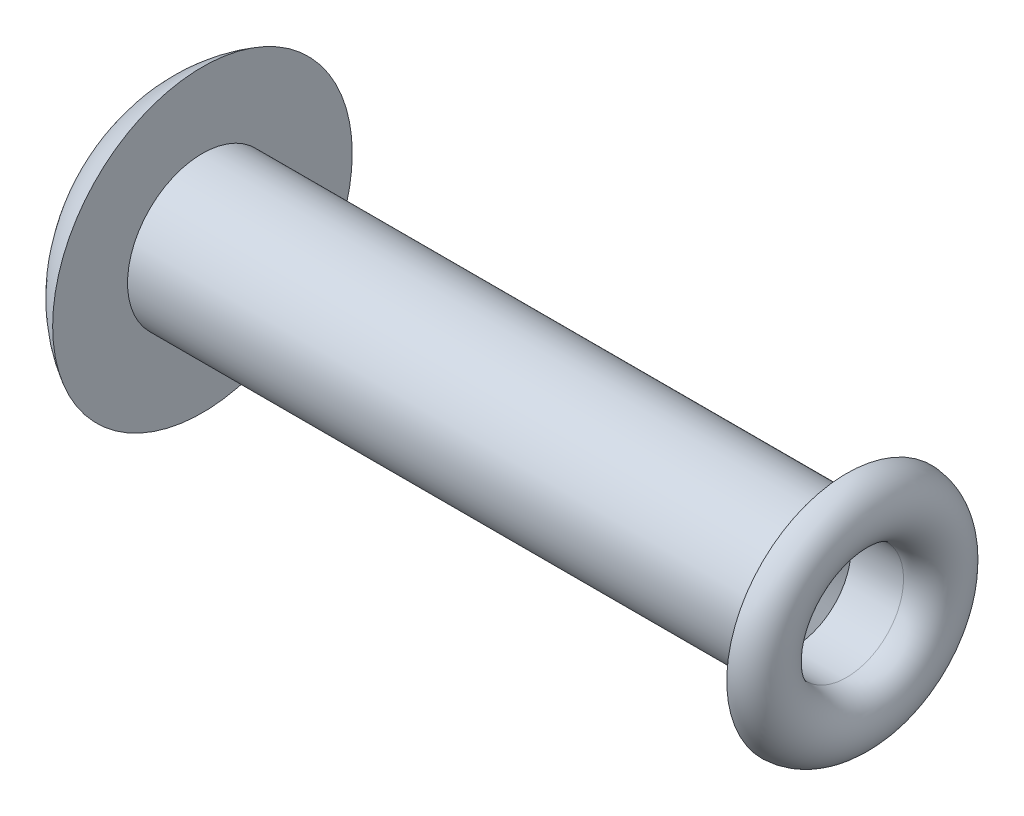
ISO-10303-21;
HEADER;
FILE_DESCRIPTION(('STEP AP214'),'2;1');
FILE_NAME('part.step','',(''),(''),'','','');
FILE_SCHEMA(('AUTOMOTIVE_DESIGN { 1 0 10303 214 1 1 1 1 }'));
ENDSEC;
DATA;
#1=APPLICATION_CONTEXT('core data for automotive mechanical design processes');
#2=APPLICATION_PROTOCOL_DEFINITION('international standard','automotive_design',2000,#1);
#3=PRODUCT_CONTEXT('',#1,'mechanical');
#4=PRODUCT('Part','Part','',(#3));
#5=PRODUCT_RELATED_PRODUCT_CATEGORY('part','',(#4));
#6=PRODUCT_DEFINITION_FORMATION('','',#4);
#7=PRODUCT_DEFINITION_CONTEXT('part definition',#1,'design');
#8=PRODUCT_DEFINITION('design','',#6,#7);
#9=PRODUCT_DEFINITION_SHAPE('','',#8);
#10=(LENGTH_UNIT() NAMED_UNIT(*) SI_UNIT(.MILLI.,.METRE.));
#11=(NAMED_UNIT(*) PLANE_ANGLE_UNIT() SI_UNIT($,.RADIAN.));
#12=(NAMED_UNIT(*) SI_UNIT($,.STERADIAN.) SOLID_ANGLE_UNIT());
#13=UNCERTAINTY_MEASURE_WITH_UNIT(LENGTH_MEASURE(1.E-05),#10,'distance_accuracy_value','');
#14=(GEOMETRIC_REPRESENTATION_CONTEXT(3) GLOBAL_UNCERTAINTY_ASSIGNED_CONTEXT((#13)) GLOBAL_UNIT_ASSIGNED_CONTEXT((#10,
#11,#12)) REPRESENTATION_CONTEXT('',''));
#15=CARTESIAN_POINT('',(0.,0.,0.));
#16=DIRECTION('',(0.,0.,1.));
#17=DIRECTION('',(1.,0.,0.));
#18=AXIS2_PLACEMENT_3D('',#15,#16,#17);
#19=CARTESIAN_POINT('',(-43.,4.99999999999999,0.));
#20=DIRECTION('',(1.,0.,0.));
#21=DIRECTION('',(0.,0.,-1.));
#22=AXIS2_PLACEMENT_3D('',#19,#20,#21);
#23=PLANE('',#22);
#24=CARTESIAN_POINT('',(-43.,0.,0.));
#25=DIRECTION('',(1.,0.,0.));
#26=DIRECTION('',(0.,0.,-1.));
#27=AXIS2_PLACEMENT_3D('',#24,#25,#26);
#28=CIRCLE('',#27,9.99999999999999);
#29=CARTESIAN_POINT('',(-43.,0.,-9.99999999999999));
#30=VERTEX_POINT('',#29);
#31=EDGE_CURVE('E11',#30,#30,#28,.T.);
#32=ORIENTED_EDGE('',*,*,#31,.T.);
#33=EDGE_LOOP('',(#32));
#34=FACE_BOUND('',#33,.T.);
#35=CARTESIAN_POINT('',(-43.,0.,0.));
#36=DIRECTION('',(1.,0.,0.));
#37=DIRECTION('',(0.,0.,-1.));
#38=AXIS2_PLACEMENT_3D('',#35,#36,#37);
#39=CIRCLE('',#38,4.99999999999999);
#40=CARTESIAN_POINT('',(-43.,0.,-4.99999999999999));
#41=VERTEX_POINT('',#40);
#42=EDGE_CURVE('E68',#41,#41,#39,.T.);
#43=ORIENTED_EDGE('',*,*,#42,.F.);
#44=EDGE_LOOP('',(#43));
#45=FACE_BOUND('',#44,.T.);
#46=ADVANCED_FACE('F32',(#34,#45),#23,.T.);
#47=CARTESIAN_POINT('',(-38.8079545454545,0.,0.));
#48=DIRECTION('',(1.,0.,0.));
#49=DIRECTION('',(0.,0.,-1.));
#50=AXIS2_PLACEMENT_3D('',#47,#48,#49);
#51=DEGENERATE_TOROIDAL_SURFACE('',#50,2.49999999999999,8.59204545454545,.T.);
#52=CARTESIAN_POINT('',(-47.4,0.,0.));
#53=DIRECTION('',(1.,0.,0.));
#54=DIRECTION('',(0.,0.,-1.));
#55=AXIS2_PLACEMENT_3D('',#52,#53,#54);
#56=CIRCLE('',#55,2.49999999999999);
#57=CARTESIAN_POINT('',(-47.4,0.,-2.49999999999999));
#58=VERTEX_POINT('',#57);
#59=EDGE_CURVE('E38',#58,#58,#56,.T.);
#60=ORIENTED_EDGE('',*,*,#59,.T.);
#61=EDGE_LOOP('',(#60));
#62=FACE_BOUND('',#61,.T.);
#63=ORIENTED_EDGE('',*,*,#31,.F.);
#64=EDGE_LOOP('',(#63));
#65=FACE_BOUND('',#64,.T.);
#66=ADVANCED_FACE('F54',(#62,#65),#51,.T.);
#67=CARTESIAN_POINT('',(-47.4,0.,0.));
#68=DIRECTION('',(-1.,0.,0.));
#69=DIRECTION('',(0.,0.,1.));
#70=AXIS2_PLACEMENT_3D('',#67,#68,#69);
#71=PLANE('',#70);
#72=ORIENTED_EDGE('',*,*,#59,.F.);
#73=EDGE_LOOP('',(#72));
#74=FACE_BOUND('',#73,.T.);
#75=ADVANCED_FACE('F44',(#74),#71,.T.);
#76=CARTESIAN_POINT('',(-5.78327035230471,0.,0.));
#77=DIRECTION('',(1.,0.,0.));
#78=DIRECTION('',(0.,0.,-1.));
#79=AXIS2_PLACEMENT_3D('',#76,#77,#78);
#80=CONICAL_SURFACE('',#79,0.,1.02974425867666);
#81=CARTESIAN_POINT('',(-3.5,0.,0.));
#82=DIRECTION('',(1.,0.,0.));
#83=DIRECTION('',(0.,0.,-1.));
#84=AXIS2_PLACEMENT_3D('',#81,#82,#83);
#85=CIRCLE('',#84,3.79999999999999);
#86=CARTESIAN_POINT('',(-3.5,0.,-3.79999999999999));
#87=VERTEX_POINT('',#86);
#88=EDGE_CURVE('E84',#87,#87,#85,.T.);
#89=ORIENTED_EDGE('',*,*,#88,.T.);
#90=EDGE_LOOP('',(#89));
#91=FACE_BOUND('',#90,.T.);
#92=CARTESIAN_POINT('',(-5.78327035230471,0.,0.));
#93=VERTEX_POINT('',#92);
#94=VERTEX_LOOP('',#93);
#95=FACE_BOUND('',#94,.T.);
#96=ADVANCED_FACE('F41',(#91,#95),#80,.F.);
#97=CARTESIAN_POINT('',(40.3769281037232,0.,0.));
#98=DIRECTION('',(1.,0.,0.));
#99=DIRECTION('',(0.,0.,-1.));
#100=AXIS2_PLACEMENT_3D('',#97,#98,#99);
#101=CYLINDRICAL_SURFACE('',#100,3.8);
#102=CARTESIAN_POINT('',(0.,0.,0.));
#103=DIRECTION('',(1.,0.,0.));
#104=DIRECTION('',(0.,0.,-1.));
#105=AXIS2_PLACEMENT_3D('',#102,#103,#104);
#106=CIRCLE('',#105,3.8);
#107=CARTESIAN_POINT('',(0.,0.,-3.8));
#108=VERTEX_POINT('',#107);
#109=EDGE_CURVE('E81',#108,#108,#106,.T.);
#110=ORIENTED_EDGE('',*,*,#109,.T.);
#111=EDGE_LOOP('',(#110));
#112=FACE_BOUND('',#111,.T.);
#113=ORIENTED_EDGE('',*,*,#88,.F.);
#114=EDGE_LOOP('',(#113));
#115=FACE_BOUND('',#114,.T.);
#116=ADVANCED_FACE('F43',(#112,#115),#101,.F.);
#117=CARTESIAN_POINT('',(-0.102499999999998,0.,0.));
#118=DIRECTION('',(1.,0.,0.));
#119=DIRECTION('',(0.,0.,-1.));
#120=AXIS2_PLACEMENT_3D('',#117,#118,#119);
#121=TOROIDAL_SURFACE('',#120,5.9,2.1025);
#122=CARTESIAN_POINT('',(0.,0.,0.));
#123=DIRECTION('',(1.,0.,0.));
#124=DIRECTION('',(0.,0.,-1.));
#125=AXIS2_PLACEMENT_3D('',#122,#123,#124);
#126=CIRCLE('',#125,8.);
#127=CARTESIAN_POINT('',(0.,0.,-8.));
#128=VERTEX_POINT('',#127);
#129=EDGE_CURVE('E78',#128,#128,#126,.T.);
#130=ORIENTED_EDGE('',*,*,#129,.T.);
#131=EDGE_LOOP('',(#130));
#132=FACE_BOUND('',#131,.T.);
#133=ORIENTED_EDGE('',*,*,#109,.F.);
#134=EDGE_LOOP('',(#133));
#135=FACE_BOUND('',#134,.T.);
#136=ADVANCED_FACE('F51',(#132,#135),#121,.T.);
#137=CARTESIAN_POINT('',(0.,8.,0.));
#138=DIRECTION('',(-1.,0.,0.));
#139=DIRECTION('',(0.,0.,1.));
#140=AXIS2_PLACEMENT_3D('',#137,#138,#139);
#141=PLANE('',#140);
#142=CARTESIAN_POINT('',(0.,0.,0.));
#143=DIRECTION('',(1.,0.,0.));
#144=DIRECTION('',(0.,0.,-1.));
#145=AXIS2_PLACEMENT_3D('',#142,#143,#144);
#146=CIRCLE('',#145,6.79414414386049);
#147=CARTESIAN_POINT('',(0.,0.,-6.79414414386049));
#148=VERTEX_POINT('',#147);
#149=EDGE_CURVE('E73',#148,#148,#146,.T.);
#150=ORIENTED_EDGE('',*,*,#149,.T.);
#151=EDGE_LOOP('',(#150));
#152=FACE_BOUND('',#151,.T.);
#153=ORIENTED_EDGE('',*,*,#129,.F.);
#154=EDGE_LOOP('',(#153));
#155=FACE_BOUND('',#154,.T.);
#156=ADVANCED_FACE('F93',(#152,#155),#141,.T.);
#157=CARTESIAN_POINT('',(-0.102499999999998,0.,0.));
#158=DIRECTION('',(1.,0.,0.));
#159=DIRECTION('',(0.,0.,-1.));
#160=AXIS2_PLACEMENT_3D('',#157,#158,#159);
#161=TOROIDAL_SURFACE('',#160,5.9,0.900000000000006);
#162=CARTESIAN_POINT('',(-0.102499999999998,0.,0.));
#163=DIRECTION('',(1.,0.,0.));
#164=DIRECTION('',(0.,0.,-1.));
#165=AXIS2_PLACEMENT_3D('',#162,#163,#164);
#166=CIRCLE('',#165,4.99999999999999);
#167=CARTESIAN_POINT('',(-0.102499999999998,0.,-4.99999999999999));
#168=VERTEX_POINT('',#167);
#169=EDGE_CURVE('E70',#168,#168,#166,.T.);
#170=ORIENTED_EDGE('',*,*,#169,.T.);
#171=EDGE_LOOP('',(#170));
#172=FACE_BOUND('',#171,.T.);
#173=ORIENTED_EDGE('',*,*,#149,.F.);
#174=EDGE_LOOP('',(#173));
#175=FACE_BOUND('',#174,.T.);
#176=ADVANCED_FACE('F99',(#172,#175),#161,.F.);
#177=CARTESIAN_POINT('',(40.3769281037232,0.,0.));
#178=DIRECTION('',(1.,0.,0.));
#179=DIRECTION('',(0.,0.,-1.));
#180=AXIS2_PLACEMENT_3D('',#177,#178,#179);
#181=CYLINDRICAL_SURFACE('',#180,4.99999999999999);
#182=ORIENTED_EDGE('',*,*,#42,.T.);
#183=EDGE_LOOP('',(#182));
#184=FACE_BOUND('',#183,.T.);
#185=ORIENTED_EDGE('',*,*,#169,.F.);
#186=EDGE_LOOP('',(#185));
#187=FACE_BOUND('',#186,.T.);
#188=ADVANCED_FACE('F105',(#184,#187),#181,.T.);
#189=CLOSED_SHELL('',(#46,#66,#75,#96,#116,#136,#156,#176,#188));
#190=MANIFOLD_SOLID_BREP('B2',#189);
#191=ADVANCED_BREP_SHAPE_REPRESENTATION('',(#18,#190),#14);
#192=SHAPE_DEFINITION_REPRESENTATION(#9,#191);
ENDSEC;
END-ISO-10303-21;
